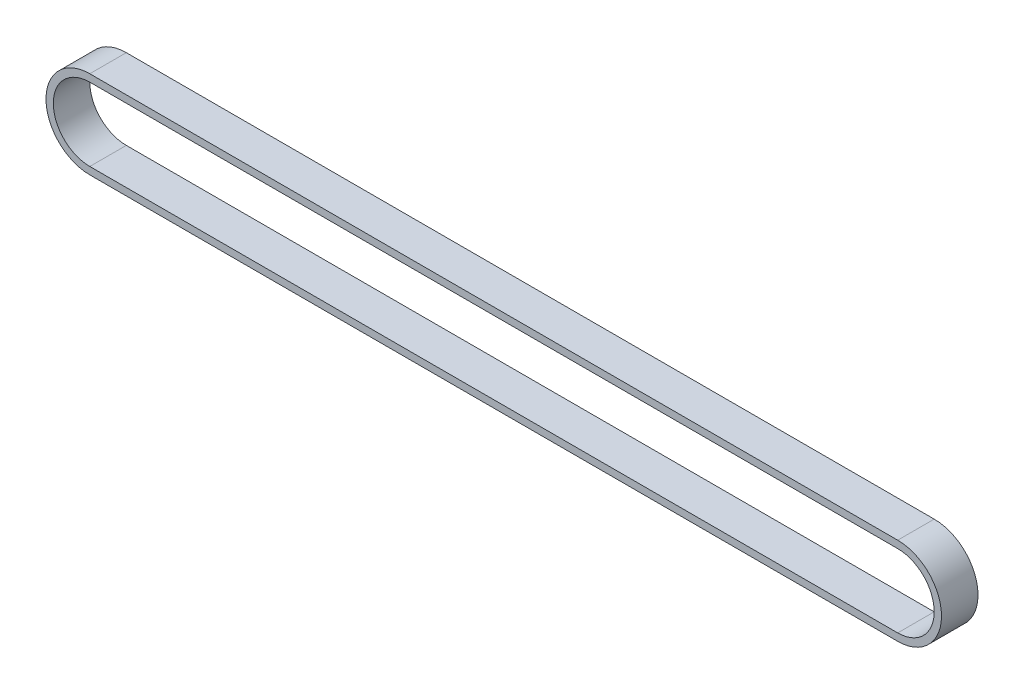
ISO-10303-21;
HEADER;
FILE_DESCRIPTION(('STEP AP214'),'2;1');
FILE_NAME('part.step','',(''),(''),'','','');
FILE_SCHEMA(('AUTOMOTIVE_DESIGN { 1 0 10303 214 1 1 1 1 }'));
ENDSEC;
DATA;
#1=APPLICATION_CONTEXT('core data for automotive mechanical design processes');
#2=APPLICATION_PROTOCOL_DEFINITION('international standard','automotive_design',2000,#1);
#3=PRODUCT_CONTEXT('',#1,'mechanical');
#4=PRODUCT('Part','Part','',(#3));
#5=PRODUCT_RELATED_PRODUCT_CATEGORY('part','',(#4));
#6=PRODUCT_DEFINITION_FORMATION('','',#4);
#7=PRODUCT_DEFINITION_CONTEXT('part definition',#1,'design');
#8=PRODUCT_DEFINITION('design','',#6,#7);
#9=PRODUCT_DEFINITION_SHAPE('','',#8);
#10=(LENGTH_UNIT() NAMED_UNIT(*) SI_UNIT(.MILLI.,.METRE.));
#11=(NAMED_UNIT(*) PLANE_ANGLE_UNIT() SI_UNIT($,.RADIAN.));
#12=(NAMED_UNIT(*) SI_UNIT($,.STERADIAN.) SOLID_ANGLE_UNIT());
#13=UNCERTAINTY_MEASURE_WITH_UNIT(LENGTH_MEASURE(1.E-05),#10,'distance_accuracy_value','');
#14=(GEOMETRIC_REPRESENTATION_CONTEXT(3) GLOBAL_UNCERTAINTY_ASSIGNED_CONTEXT((#13)) GLOBAL_UNIT_ASSIGNED_CONTEXT((#10,
#11,#12)) REPRESENTATION_CONTEXT('',''));
#15=CARTESIAN_POINT('',(0.,0.,0.));
#16=DIRECTION('',(0.,0.,1.));
#17=DIRECTION('',(1.,0.,0.));
#18=AXIS2_PLACEMENT_3D('',#15,#16,#17);
#19=CARTESIAN_POINT('',(0.,0.,15.));
#20=DIRECTION('',(0.,0.,1.));
#21=DIRECTION('',(1.,0.,0.));
#22=AXIS2_PLACEMENT_3D('',#19,#20,#21);
#23=PLANE('',#22);
#24=CARTESIAN_POINT('',(0.,0.,15.));
#25=DIRECTION('',(0.,0.,1.));
#26=DIRECTION('',(1.,0.,0.));
#27=AXIS2_PLACEMENT_3D('',#24,#25,#26);
#28=CIRCLE('',#27,18.);
#29=CARTESIAN_POINT('',(0.,-18.,15.));
#30=VERTEX_POINT('',#29);
#31=CARTESIAN_POINT('',(0.,18.,15.));
#32=VERTEX_POINT('',#31);
#33=EDGE_CURVE('E153',#30,#32,#28,.T.);
#34=ORIENTED_EDGE('',*,*,#33,.T.);
#35=DIRECTION('',(-1.,0.,0.));
#36=VECTOR('',#35,1.);
#37=CARTESIAN_POINT('',(0.,18.,15.));
#38=LINE('',#37,#36);
#39=CARTESIAN_POINT('',(-332.,18.,15.));
#40=VERTEX_POINT('',#39);
#41=EDGE_CURVE('E157',#32,#40,#38,.T.);
#42=ORIENTED_EDGE('',*,*,#41,.T.);
#43=CARTESIAN_POINT('',(-332.,0.,15.));
#44=DIRECTION('',(0.,0.,1.));
#45=DIRECTION('',(1.,0.,0.));
#46=AXIS2_PLACEMENT_3D('',#43,#44,#45);
#47=CIRCLE('',#46,18.);
#48=CARTESIAN_POINT('',(-332.,-18.,15.));
#49=VERTEX_POINT('',#48);
#50=EDGE_CURVE('E161',#40,#49,#47,.T.);
#51=ORIENTED_EDGE('',*,*,#50,.T.);
#52=DIRECTION('',(1.,0.,0.));
#53=VECTOR('',#52,1.);
#54=CARTESIAN_POINT('',(0.,-18.,15.));
#55=LINE('',#54,#53);
#56=EDGE_CURVE('E164',#49,#30,#55,.T.);
#57=ORIENTED_EDGE('',*,*,#56,.T.);
#58=EDGE_LOOP('',(#34,#42,#51,#57));
#59=FACE_BOUND('',#58,.T.);
#60=DIRECTION('',(-1.,0.,0.));
#61=VECTOR('',#60,1.);
#62=CARTESIAN_POINT('',(0.,15.,15.));
#63=LINE('',#62,#61);
#64=CARTESIAN_POINT('',(0.,15.,15.));
#65=VERTEX_POINT('',#64);
#66=CARTESIAN_POINT('',(-332.,15.,15.));
#67=VERTEX_POINT('',#66);
#68=EDGE_CURVE('E114',#65,#67,#63,.T.);
#69=ORIENTED_EDGE('',*,*,#68,.F.);
#70=CARTESIAN_POINT('',(0.,0.,15.));
#71=DIRECTION('',(0.,0.,1.));
#72=DIRECTION('',(1.,0.,0.));
#73=AXIS2_PLACEMENT_3D('',#70,#71,#72);
#74=CIRCLE('',#73,15.);
#75=CARTESIAN_POINT('',(0.,-15.,15.));
#76=VERTEX_POINT('',#75);
#77=EDGE_CURVE('E105',#76,#65,#74,.T.);
#78=ORIENTED_EDGE('',*,*,#77,.F.);
#79=DIRECTION('',(1.,0.,0.));
#80=VECTOR('',#79,1.);
#81=CARTESIAN_POINT('',(0.,-15.,15.));
#82=LINE('',#81,#80);
#83=CARTESIAN_POINT('',(-332.,-15.,15.));
#84=VERTEX_POINT('',#83);
#85=EDGE_CURVE('E131',#84,#76,#82,.T.);
#86=ORIENTED_EDGE('',*,*,#85,.F.);
#87=CARTESIAN_POINT('',(-332.,0.,15.));
#88=DIRECTION('',(0.,0.,1.));
#89=DIRECTION('',(1.,0.,0.));
#90=AXIS2_PLACEMENT_3D('',#87,#88,#89);
#91=CIRCLE('',#90,15.);
#92=EDGE_CURVE('E127',#67,#84,#91,.T.);
#93=ORIENTED_EDGE('',*,*,#92,.F.);
#94=EDGE_LOOP('',(#69,#78,#86,#93));
#95=FACE_BOUND('',#94,.T.);
#96=ADVANCED_FACE('F39',(#59,#95),#23,.T.);
#97=CARTESIAN_POINT('',(0.,0.,0.));
#98=DIRECTION('',(0.,0.,1.));
#99=DIRECTION('',(1.,0.,0.));
#100=AXIS2_PLACEMENT_3D('',#97,#98,#99);
#101=PLANE('',#100);
#102=CARTESIAN_POINT('',(0.,0.,0.));
#103=DIRECTION('',(0.,0.,1.));
#104=DIRECTION('',(1.,0.,0.));
#105=AXIS2_PLACEMENT_3D('',#102,#103,#104);
#106=CIRCLE('',#105,18.);
#107=CARTESIAN_POINT('',(0.,-18.,0.));
#108=VERTEX_POINT('',#107);
#109=CARTESIAN_POINT('',(0.,18.,0.));
#110=VERTEX_POINT('',#109);
#111=EDGE_CURVE('E123',#108,#110,#106,.T.);
#112=ORIENTED_EDGE('',*,*,#111,.F.);
#113=DIRECTION('',(1.,0.,0.));
#114=VECTOR('',#113,1.);
#115=CARTESIAN_POINT('',(0.,-18.,0.));
#116=LINE('',#115,#114);
#117=CARTESIAN_POINT('',(-332.,-18.,0.));
#118=VERTEX_POINT('',#117);
#119=EDGE_CURVE('E158',#118,#108,#116,.T.);
#120=ORIENTED_EDGE('',*,*,#119,.F.);
#121=CARTESIAN_POINT('',(-332.,0.,0.));
#122=DIRECTION('',(0.,0.,1.));
#123=DIRECTION('',(1.,0.,0.));
#124=AXIS2_PLACEMENT_3D('',#121,#122,#123);
#125=CIRCLE('',#124,18.);
#126=CARTESIAN_POINT('',(-332.,18.,0.));
#127=VERTEX_POINT('',#126);
#128=EDGE_CURVE('E174',#127,#118,#125,.T.);
#129=ORIENTED_EDGE('',*,*,#128,.F.);
#130=DIRECTION('',(-1.,0.,0.));
#131=VECTOR('',#130,1.);
#132=CARTESIAN_POINT('',(0.,18.,0.));
#133=LINE('',#132,#131);
#134=EDGE_CURVE('E171',#110,#127,#133,.T.);
#135=ORIENTED_EDGE('',*,*,#134,.F.);
#136=EDGE_LOOP('',(#112,#120,#129,#135));
#137=FACE_BOUND('',#136,.T.);
#138=CARTESIAN_POINT('',(0.,0.,0.));
#139=DIRECTION('',(0.,0.,1.));
#140=DIRECTION('',(1.,0.,0.));
#141=AXIS2_PLACEMENT_3D('',#138,#139,#140);
#142=CIRCLE('',#141,15.);
#143=CARTESIAN_POINT('',(0.,-15.,0.));
#144=VERTEX_POINT('',#143);
#145=CARTESIAN_POINT('',(0.,15.,0.));
#146=VERTEX_POINT('',#145);
#147=EDGE_CURVE('E63',#144,#146,#142,.T.);
#148=ORIENTED_EDGE('',*,*,#147,.T.);
#149=DIRECTION('',(-1.,0.,0.));
#150=VECTOR('',#149,1.);
#151=CARTESIAN_POINT('',(0.,15.,0.));
#152=LINE('',#151,#150);
#153=CARTESIAN_POINT('',(-332.,15.,0.));
#154=VERTEX_POINT('',#153);
#155=EDGE_CURVE('E121',#146,#154,#152,.T.);
#156=ORIENTED_EDGE('',*,*,#155,.T.);
#157=CARTESIAN_POINT('',(-332.,0.,0.));
#158=DIRECTION('',(0.,0.,1.));
#159=DIRECTION('',(1.,0.,0.));
#160=AXIS2_PLACEMENT_3D('',#157,#158,#159);
#161=CIRCLE('',#160,15.);
#162=CARTESIAN_POINT('',(-332.,-15.,0.));
#163=VERTEX_POINT('',#162);
#164=EDGE_CURVE('E140',#154,#163,#161,.T.);
#165=ORIENTED_EDGE('',*,*,#164,.T.);
#166=DIRECTION('',(1.,0.,0.));
#167=VECTOR('',#166,1.);
#168=CARTESIAN_POINT('',(0.,-15.,0.));
#169=LINE('',#168,#167);
#170=EDGE_CURVE('E115',#163,#144,#169,.T.);
#171=ORIENTED_EDGE('',*,*,#170,.T.);
#172=EDGE_LOOP('',(#148,#156,#165,#171));
#173=FACE_BOUND('',#172,.T.);
#174=ADVANCED_FACE('F197',(#137,#173),#101,.F.);
#175=CARTESIAN_POINT('',(0.,0.,15.));
#176=DIRECTION('',(0.,0.,-1.));
#177=DIRECTION('',(-1.,0.,0.));
#178=AXIS2_PLACEMENT_3D('',#175,#176,#177);
#179=CYLINDRICAL_SURFACE('',#178,18.);
#180=ORIENTED_EDGE('',*,*,#111,.T.);
#181=DIRECTION('',(0.,0.,-1.));
#182=VECTOR('',#181,1.);
#183=CARTESIAN_POINT('',(0.,18.,15.));
#184=LINE('',#183,#182);
#185=EDGE_CURVE('E11',#32,#110,#184,.T.);
#186=ORIENTED_EDGE('',*,*,#185,.F.);
#187=ORIENTED_EDGE('',*,*,#33,.F.);
#188=DIRECTION('',(0.,0.,-1.));
#189=VECTOR('',#188,1.);
#190=CARTESIAN_POINT('',(0.,-18.,15.));
#191=LINE('',#190,#189);
#192=EDGE_CURVE('E167',#30,#108,#191,.T.);
#193=ORIENTED_EDGE('',*,*,#192,.T.);
#194=EDGE_LOOP('',(#180,#186,#187,#193));
#195=FACE_BOUND('',#194,.T.);
#196=ADVANCED_FACE('F41',(#195),#179,.T.);
#197=CARTESIAN_POINT('',(0.,18.,15.));
#198=DIRECTION('',(0.,-1.,0.));
#199=DIRECTION('',(1.,0.,0.));
#200=AXIS2_PLACEMENT_3D('',#197,#198,#199);
#201=PLANE('',#200);
#202=ORIENTED_EDGE('',*,*,#134,.T.);
#203=DIRECTION('',(0.,0.,-1.));
#204=VECTOR('',#203,1.);
#205=CARTESIAN_POINT('',(-332.,18.,15.));
#206=LINE('',#205,#204);
#207=EDGE_CURVE('E48',#40,#127,#206,.T.);
#208=ORIENTED_EDGE('',*,*,#207,.F.);
#209=ORIENTED_EDGE('',*,*,#41,.F.);
#210=ORIENTED_EDGE('',*,*,#185,.T.);
#211=EDGE_LOOP('',(#202,#208,#209,#210));
#212=FACE_BOUND('',#211,.T.);
#213=ADVANCED_FACE('F207',(#212),#201,.F.);
#214=CARTESIAN_POINT('',(-332.,0.,15.));
#215=DIRECTION('',(0.,0.,-1.));
#216=DIRECTION('',(-1.,0.,0.));
#217=AXIS2_PLACEMENT_3D('',#214,#215,#216);
#218=CYLINDRICAL_SURFACE('',#217,18.);
#219=ORIENTED_EDGE('',*,*,#128,.T.);
#220=DIRECTION('',(0.,0.,-1.));
#221=VECTOR('',#220,1.);
#222=CARTESIAN_POINT('',(-332.,-18.,15.));
#223=LINE('',#222,#221);
#224=EDGE_CURVE('E182',#49,#118,#223,.T.);
#225=ORIENTED_EDGE('',*,*,#224,.F.);
#226=ORIENTED_EDGE('',*,*,#50,.F.);
#227=ORIENTED_EDGE('',*,*,#207,.T.);
#228=EDGE_LOOP('',(#219,#225,#226,#227));
#229=FACE_BOUND('',#228,.T.);
#230=ADVANCED_FACE('F191',(#229),#218,.T.);
#231=CARTESIAN_POINT('',(0.,-18.,15.));
#232=DIRECTION('',(0.,1.,0.));
#233=DIRECTION('',(-1.,0.,0.));
#234=AXIS2_PLACEMENT_3D('',#231,#232,#233);
#235=PLANE('',#234);
#236=ORIENTED_EDGE('',*,*,#119,.T.);
#237=ORIENTED_EDGE('',*,*,#192,.F.);
#238=ORIENTED_EDGE('',*,*,#56,.F.);
#239=ORIENTED_EDGE('',*,*,#224,.T.);
#240=EDGE_LOOP('',(#236,#237,#238,#239));
#241=FACE_BOUND('',#240,.T.);
#242=ADVANCED_FACE('F201',(#241),#235,.F.);
#243=CARTESIAN_POINT('',(0.,0.,15.));
#244=DIRECTION('',(0.,0.,-1.));
#245=DIRECTION('',(-1.,0.,0.));
#246=AXIS2_PLACEMENT_3D('',#243,#244,#245);
#247=CYLINDRICAL_SURFACE('',#246,15.);
#248=ORIENTED_EDGE('',*,*,#147,.F.);
#249=DIRECTION('',(0.,0.,-1.));
#250=VECTOR('',#249,1.);
#251=CARTESIAN_POINT('',(0.,-15.,15.));
#252=LINE('',#251,#250);
#253=EDGE_CURVE('E109',#76,#144,#252,.T.);
#254=ORIENTED_EDGE('',*,*,#253,.F.);
#255=ORIENTED_EDGE('',*,*,#77,.T.);
#256=DIRECTION('',(0.,0.,-1.));
#257=VECTOR('',#256,1.);
#258=CARTESIAN_POINT('',(0.,15.,15.));
#259=LINE('',#258,#257);
#260=EDGE_CURVE('E108',#65,#146,#259,.T.);
#261=ORIENTED_EDGE('',*,*,#260,.T.);
#262=EDGE_LOOP('',(#248,#254,#255,#261));
#263=FACE_BOUND('',#262,.T.);
#264=ADVANCED_FACE('F107',(#263),#247,.F.);
#265=CARTESIAN_POINT('',(0.,15.,15.));
#266=DIRECTION('',(0.,-1.,0.));
#267=DIRECTION('',(1.,0.,0.));
#268=AXIS2_PLACEMENT_3D('',#265,#266,#267);
#269=PLANE('',#268);
#270=ORIENTED_EDGE('',*,*,#155,.F.);
#271=ORIENTED_EDGE('',*,*,#260,.F.);
#272=ORIENTED_EDGE('',*,*,#68,.T.);
#273=DIRECTION('',(0.,0.,-1.));
#274=VECTOR('',#273,1.);
#275=CARTESIAN_POINT('',(-332.,15.,15.));
#276=LINE('',#275,#274);
#277=EDGE_CURVE('E124',#67,#154,#276,.T.);
#278=ORIENTED_EDGE('',*,*,#277,.T.);
#279=EDGE_LOOP('',(#270,#271,#272,#278));
#280=FACE_BOUND('',#279,.T.);
#281=ADVANCED_FACE('F118',(#280),#269,.T.);
#282=CARTESIAN_POINT('',(-332.,0.,15.));
#283=DIRECTION('',(0.,0.,-1.));
#284=DIRECTION('',(-1.,0.,0.));
#285=AXIS2_PLACEMENT_3D('',#282,#283,#284);
#286=CYLINDRICAL_SURFACE('',#285,15.);
#287=ORIENTED_EDGE('',*,*,#164,.F.);
#288=ORIENTED_EDGE('',*,*,#277,.F.);
#289=ORIENTED_EDGE('',*,*,#92,.T.);
#290=DIRECTION('',(0.,0.,-1.));
#291=VECTOR('',#290,1.);
#292=CARTESIAN_POINT('',(-332.,-15.,15.));
#293=LINE('',#292,#291);
#294=EDGE_CURVE('E55',#84,#163,#293,.T.);
#295=ORIENTED_EDGE('',*,*,#294,.T.);
#296=EDGE_LOOP('',(#287,#288,#289,#295));
#297=FACE_BOUND('',#296,.T.);
#298=ADVANCED_FACE('F230',(#297),#286,.F.);
#299=CARTESIAN_POINT('',(0.,-15.,15.));
#300=DIRECTION('',(0.,1.,0.));
#301=DIRECTION('',(-1.,0.,0.));
#302=AXIS2_PLACEMENT_3D('',#299,#300,#301);
#303=PLANE('',#302);
#304=ORIENTED_EDGE('',*,*,#170,.F.);
#305=ORIENTED_EDGE('',*,*,#294,.F.);
#306=ORIENTED_EDGE('',*,*,#85,.T.);
#307=ORIENTED_EDGE('',*,*,#253,.T.);
#308=EDGE_LOOP('',(#304,#305,#306,#307));
#309=FACE_BOUND('',#308,.T.);
#310=ADVANCED_FACE('F234',(#309),#303,.T.);
#311=CLOSED_SHELL('',(#96,#174,#196,#213,#230,#242,#264,#281,#298,#310));
#312=MANIFOLD_SOLID_BREP('B2',#311);
#313=ADVANCED_BREP_SHAPE_REPRESENTATION('',(#18,#312),#14);
#314=SHAPE_DEFINITION_REPRESENTATION(#9,#313);
ENDSEC;
END-ISO-10303-21;
